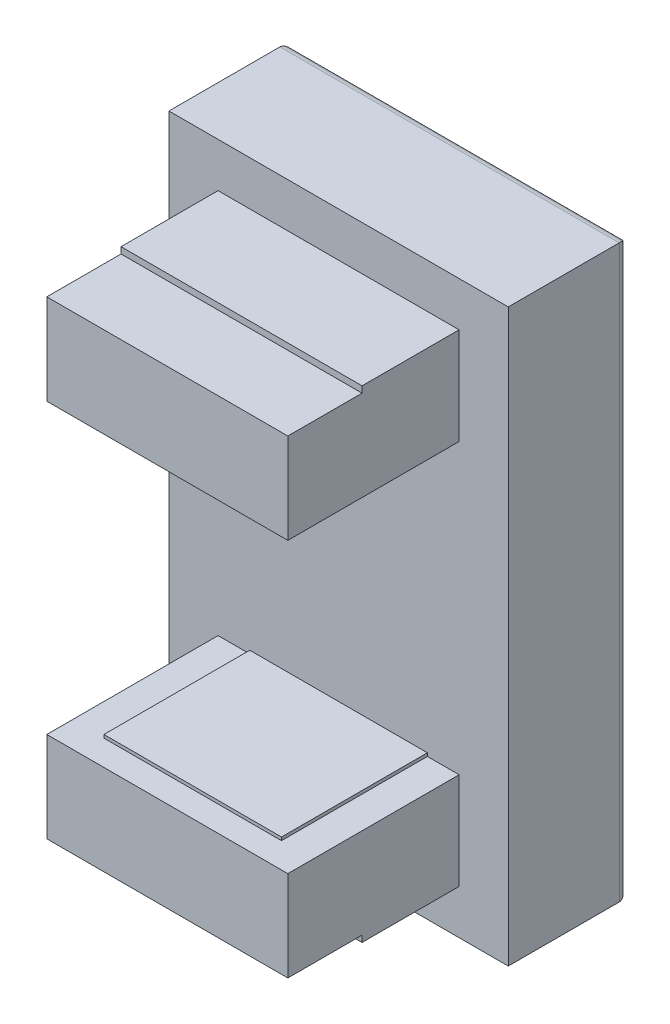
ISO-10303-21;
HEADER;
FILE_DESCRIPTION(('STEP AP214'),'2;1');
FILE_NAME('part.step','',(''),(''),'','','');
FILE_SCHEMA(('AUTOMOTIVE_DESIGN { 1 0 10303 214 1 1 1 1 }'));
ENDSEC;
DATA;
#1=APPLICATION_CONTEXT('core data for automotive mechanical design processes');
#2=APPLICATION_PROTOCOL_DEFINITION('international standard','automotive_design',2000,#1);
#3=PRODUCT_CONTEXT('',#1,'mechanical');
#4=PRODUCT('Part','Part','',(#3));
#5=PRODUCT_RELATED_PRODUCT_CATEGORY('part','',(#4));
#6=PRODUCT_DEFINITION_FORMATION('','',#4);
#7=PRODUCT_DEFINITION_CONTEXT('part definition',#1,'design');
#8=PRODUCT_DEFINITION('design','',#6,#7);
#9=PRODUCT_DEFINITION_SHAPE('','',#8);
#10=(LENGTH_UNIT() NAMED_UNIT(*) SI_UNIT(.MILLI.,.METRE.));
#11=(NAMED_UNIT(*) PLANE_ANGLE_UNIT() SI_UNIT($,.RADIAN.));
#12=(NAMED_UNIT(*) SI_UNIT($,.STERADIAN.) SOLID_ANGLE_UNIT());
#13=UNCERTAINTY_MEASURE_WITH_UNIT(LENGTH_MEASURE(1.E-05),#10,'distance_accuracy_value','');
#14=(GEOMETRIC_REPRESENTATION_CONTEXT(3) GLOBAL_UNCERTAINTY_ASSIGNED_CONTEXT((#13)) GLOBAL_UNIT_ASSIGNED_CONTEXT((#10,
#11,#12)) REPRESENTATION_CONTEXT('',''));
#15=CARTESIAN_POINT('',(0.,0.,0.));
#16=DIRECTION('',(0.,0.,1.));
#17=DIRECTION('',(1.,0.,0.));
#18=AXIS2_PLACEMENT_3D('',#15,#16,#17);
#19=CARTESIAN_POINT('',(59.620001155307,70.760000207209,-1.870522106092));
#20=DIRECTION('',(8.74227765734796E-08,0.999999999999995,4.37113882867398E-08));
#21=DIRECTION('',(-0.999999999999996,8.74227765734797E-08,0.));
#22=AXIS2_PLACEMENT_3D('',#19,#20,#21);
#23=PLANE('',#22);
#24=DIRECTION('',(0.,0.,1.));
#25=VECTOR('',#24,1.);
#26=CARTESIAN_POINT('',(54.6200011553068,70.760000634095,-2.556522040525));
#27=LINE('',#26,#25);
#28=CARTESIAN_POINT('',(54.620001155307,70.7600006008744,-1.63652210297748));
#29=VERTEX_POINT('',#28);
#30=CARTESIAN_POINT('',(54.62000115487,70.7600006417659,-1.87052210609216));
#31=VERTEX_POINT('',#30);
#32=EDGE_CURVE('E352',#29,#31,#27,.F.);
#33=ORIENTED_EDGE('',*,*,#32,.T.);
#34=DIRECTION('',(1.,0.,0.));
#35=VECTOR('',#34,1.);
#36=CARTESIAN_POINT('',(59.620001152684,70.760000644323,-1.87052210609264));
#37=LINE('',#36,#35);
#38=CARTESIAN_POINT('',(55.380001155307,70.7600006111024,-1.87052210631081));
#39=VERTEX_POINT('',#38);
#40=EDGE_CURVE('E379',#31,#39,#37,.T.);
#41=ORIENTED_EDGE('',*,*,#40,.T.);
#42=DIRECTION('',(0.,0.,1.));
#43=VECTOR('',#42,1.);
#44=CARTESIAN_POINT('',(55.3800011553068,70.760000577882,-2.556522040525));
#45=LINE('',#44,#43);
#46=CARTESIAN_POINT('',(55.380001161536,70.7600005702106,-1.63652210609199));
#47=VERTEX_POINT('',#46);
#48=EDGE_CURVE('E366',#39,#47,#45,.T.);
#49=ORIENTED_EDGE('',*,*,#48,.T.);
#50=DIRECTION('',(1.,0.,0.));
#51=VECTOR('',#50,1.);
#52=CARTESIAN_POINT('',(59.620001155307,70.760000567654,-1.63652210609198));
#53=LINE('',#52,#51);
#54=EDGE_CURVE('E377',#47,#29,#53,.F.);
#55=ORIENTED_EDGE('',*,*,#54,.T.);
#56=EDGE_LOOP('',(#33,#41,#49,#55));
#57=FACE_BOUND('',#56,.T.);
#58=ADVANCED_FACE('F17',(#57),#23,.F.);
#59=CARTESIAN_POINT('',(59.620001152684,70.730000207209,-1.870522107404));
#60=DIRECTION('',(0.,4.371138828674E-08,-0.999999999999999));
#61=DIRECTION('',(0.,0.999999999999999,4.371138828674E-08));
#62=AXIS2_PLACEMENT_3D('',#59,#60,#61);
#63=PLANE('',#62);
#64=DIRECTION('',(8.74227765734797E-08,0.999999999999996,0.));
#65=VECTOR('',#64,1.);
#66=CARTESIAN_POINT('',(54.620001286441,72.260000674309,-1.870522106092));
#67=LINE('',#66,#65);
#68=CARTESIAN_POINT('',(54.6200011535588,70.7400006277129,-1.87052210674771));
#69=VERTEX_POINT('',#68);
#70=EDGE_CURVE('E349',#31,#69,#67,.F.);
#71=ORIENTED_EDGE('',*,*,#70,.T.);
#72=DIRECTION('',(-0.999999999999996,8.74227765734797E-08,0.));
#73=VECTOR('',#72,1.);
#74=CARTESIAN_POINT('',(55.380001153559,70.740000577882,-1.870522106966));
#75=LINE('',#74,#73);
#76=CARTESIAN_POINT('',(55.3800011539957,70.74000058457,-1.87052210696621));
#77=VERTEX_POINT('',#76);
#78=EDGE_CURVE('E359',#69,#77,#75,.F.);
#79=ORIENTED_EDGE('',*,*,#78,.T.);
#80=DIRECTION('',(-8.74227765734797E-08,-0.999999999999996,0.));
#81=VECTOR('',#80,1.);
#82=CARTESIAN_POINT('',(55.380001286441,72.260000607868,-1.870522106966));
#83=LINE('',#82,#81);
#84=EDGE_CURVE('E368',#77,#39,#83,.F.);
#85=ORIENTED_EDGE('',*,*,#84,.T.);
#86=ORIENTED_EDGE('',*,*,#40,.F.);
#87=EDGE_LOOP('',(#71,#79,#85,#86));
#88=FACE_BOUND('',#87,.T.);
#89=ADVANCED_FACE('F722',(#88),#63,.F.);
#90=CARTESIAN_POINT('',(59.620001155307,70.760000196981,-1.636522106092));
#91=DIRECTION('',(0.,4.371138828674E-08,-0.999999999999999));
#92=DIRECTION('',(0.,0.999999999999999,4.371138828674E-08));
#93=AXIS2_PLACEMENT_3D('',#90,#91,#92);
#94=PLANE('',#93);
#95=DIRECTION('',(8.74227765734797E-08,0.999999999999996,0.));
#96=VECTOR('',#95,1.);
#97=CARTESIAN_POINT('',(54.620001286441,72.260000674309,-1.636522093634));
#98=LINE('',#97,#96);
#99=CARTESIAN_POINT('',(54.6200011677648,71.0450006399959,-1.63652209363411));
#100=VERTEX_POINT('',#99);
#101=EDGE_CURVE('E354',#100,#29,#98,.F.);
#102=ORIENTED_EDGE('',*,*,#101,.T.);
#103=ORIENTED_EDGE('',*,*,#54,.F.);
#104=DIRECTION('',(-8.74227765734797E-08,-0.999999999999996,0.));
#105=VECTOR('',#104,1.);
#106=CARTESIAN_POINT('',(55.380001286441,72.260000607868,-1.636522106092));
#107=LINE('',#106,#105);
#108=CARTESIAN_POINT('',(55.3800011802228,71.0450006008743,-1.63652209674861));
#109=VERTEX_POINT('',#108);
#110=EDGE_CURVE('E364',#47,#109,#107,.F.);
#111=ORIENTED_EDGE('',*,*,#110,.T.);
#112=DIRECTION('',(0.999999999999996,-8.74227765734797E-08,0.));
#113=VECTOR('',#112,1.);
#114=CARTESIAN_POINT('',(55.380001180223,71.0450005676532,-1.636522093634));
#115=LINE('',#114,#113);
#116=EDGE_CURVE('E347',#109,#100,#115,.F.);
#117=ORIENTED_EDGE('',*,*,#116,.T.);
#118=EDGE_LOOP('',(#102,#103,#111,#117));
#119=FACE_BOUND('',#118,.T.);
#120=ADVANCED_FACE('F712',(#119),#94,.F.);
#121=CARTESIAN_POINT('',(55.380001180223,71.04500057115,-1.716522093634));
#122=DIRECTION('',(0.,4.371138828674E-08,-0.999999999999999));
#123=DIRECTION('',(0.,0.999999999999999,4.371138828674E-08));
#124=AXIS2_PLACEMENT_3D('',#121,#122,#123);
#125=PLANE('',#124);
#126=DIRECTION('',(-8.74227765734797E-08,-0.999999999999996,0.));
#127=VECTOR('',#126,1.);
#128=CARTESIAN_POINT('',(55.280001259777,71.955000575522,-1.716522093634));
#129=LINE('',#128,#127);
#130=CARTESIAN_POINT('',(55.2800011806598,71.0450005849196,-1.716522093634));
#131=VERTEX_POINT('',#130);
#132=CARTESIAN_POINT('',(55.2800011810968,71.0550005921322,-1.71652209341547));
#133=VERTEX_POINT('',#132);
#134=EDGE_CURVE('E371',#131,#133,#129,.F.);
#135=ORIENTED_EDGE('',*,*,#134,.T.);
#136=DIRECTION('',(-0.999999999999996,8.74227765734797E-08,0.));
#137=VECTOR('',#136,1.);
#138=CARTESIAN_POINT('',(59.620001181097,71.0550002004778,-1.716522093197));
#139=LINE('',#138,#137);
#140=CARTESIAN_POINT('',(54.7200011808782,71.0550006389033,-1.71652209319697));
#141=VERTEX_POINT('',#140);
#142=EDGE_CURVE('E324',#141,#133,#139,.F.);
#143=ORIENTED_EDGE('',*,*,#142,.F.);
#144=DIRECTION('',(8.74227765734797E-08,0.999999999999996,0.));
#145=VECTOR('',#144,1.);
#146=CARTESIAN_POINT('',(54.720001259777,71.955000624478,-1.716522093197));
#147=LINE('',#146,#145);
#148=CARTESIAN_POINT('',(54.7200011802228,71.0450006166103,-1.71652209352475));
#149=VERTEX_POINT('',#148);
#150=EDGE_CURVE('E333',#141,#149,#147,.F.);
#151=ORIENTED_EDGE('',*,*,#150,.T.);
#152=DIRECTION('',(0.999999999999996,-8.74227765734797E-08,0.));
#153=VECTOR('',#152,1.);
#154=CARTESIAN_POINT('',(55.380001180223,71.0450005711501,-1.716522093634));
#155=LINE('',#154,#153);
#156=EDGE_CURVE('E343',#149,#131,#155,.T.);
#157=ORIENTED_EDGE('',*,*,#156,.T.);
#158=EDGE_LOOP('',(#135,#143,#151,#157));
#159=FACE_BOUND('',#158,.T.);
#160=ADVANCED_FACE('F702',(#159),#125,.F.);
#161=CARTESIAN_POINT('',(55.380001180223,71.04500057115,-1.716522093634));
#162=DIRECTION('',(0.,4.371138828674E-08,-0.999999999999999));
#163=DIRECTION('',(0.,0.999999999999999,4.371138828674E-08));
#164=AXIS2_PLACEMENT_3D('',#161,#162,#163);
#165=PLANE('',#164);
#166=DIRECTION('',(8.74227765734797E-08,0.999999999999996,0.));
#167=VECTOR('',#166,1.);
#168=CARTESIAN_POINT('',(54.720001259777,71.955000624478,-1.716522053857));
#169=LINE('',#168,#167);
#170=CARTESIAN_POINT('',(54.72000125934,71.9550006338766,-1.71652205385682));
#171=VERTEX_POINT('',#170);
#172=CARTESIAN_POINT('',(54.7200012589029,71.9450006166105,-1.71652205418469));
#173=VERTEX_POINT('',#172);
#174=EDGE_CURVE('E299',#171,#173,#169,.F.);
#175=ORIENTED_EDGE('',*,*,#174,.T.);
#176=DIRECTION('',(0.999999999999996,-8.74227765734797E-08,0.));
#177=VECTOR('',#176,1.);
#178=CARTESIAN_POINT('',(59.620001258903,71.945000200478,-1.716522054294));
#179=LINE('',#178,#177);
#180=CARTESIAN_POINT('',(55.2800012593399,71.9450005849197,-1.71652205429388));
#181=VERTEX_POINT('',#180);
#182=EDGE_CURVE('E307',#181,#173,#179,.F.);
#183=ORIENTED_EDGE('',*,*,#182,.F.);
#184=DIRECTION('',(-8.74227765734797E-08,-0.999999999999996,0.));
#185=VECTOR('',#184,1.);
#186=CARTESIAN_POINT('',(55.280001259777,71.955000575522,-1.716522054294));
#187=LINE('',#186,#185);
#188=CARTESIAN_POINT('',(55.280001259777,71.9550005921321,-1.71652205407541));
#189=VERTEX_POINT('',#188);
#190=EDGE_CURVE('E309',#181,#189,#187,.F.);
#191=ORIENTED_EDGE('',*,*,#190,.T.);
#192=DIRECTION('',(-0.999999999999996,8.74227765734797E-08,0.));
#193=VECTOR('',#192,1.);
#194=CARTESIAN_POINT('',(55.380001259777,71.9550005711502,-1.716522053857));
#195=LINE('',#194,#193);
#196=EDGE_CURVE('E291',#189,#171,#195,.T.);
#197=ORIENTED_EDGE('',*,*,#196,.T.);
#198=EDGE_LOOP('',(#175,#183,#191,#197));
#199=FACE_BOUND('',#198,.T.);
#200=ADVANCED_FACE('F692',(#199),#165,.F.);
#201=CARTESIAN_POINT('',(59.620001287316,72.270000207209,-1.870522040088));
#202=DIRECTION('',(0.,-4.371138828674E-08,0.999999999999999));
#203=DIRECTION('',(0.,-0.999999999999999,-4.371138828674E-08));
#204=AXIS2_PLACEMENT_3D('',#201,#202,#203);
#205=PLANE('',#204);
#206=DIRECTION('',(8.74227765734797E-08,0.999999999999996,0.));
#207=VECTOR('',#206,1.);
#208=CARTESIAN_POINT('',(54.620001286441,72.260000674309,-1.870522040525));
#209=LINE('',#208,#207);
#210=CARTESIAN_POINT('',(54.620001286441,72.2600006310569,-1.87052204052502));
#211=VERTEX_POINT('',#210);
#212=CARTESIAN_POINT('',(54.6200012855669,72.2400006443231,-1.87052204118065));
#213=VERTEX_POINT('',#212);
#214=EDGE_CURVE('E287',#211,#213,#209,.F.);
#215=ORIENTED_EDGE('',*,*,#214,.T.);
#216=DIRECTION('',(0.999999999999996,-8.74227765734797E-08,0.));
#217=VECTOR('',#216,1.);
#218=CARTESIAN_POINT('',(59.620001284693,72.2400002072095,-1.870522041399));
#219=LINE('',#218,#217);
#220=CARTESIAN_POINT('',(55.3800012846929,72.2400005919353,-1.87052204139908));
#221=VERTEX_POINT('',#220);
#222=EDGE_CURVE('E375',#213,#221,#219,.T.);
#223=ORIENTED_EDGE('',*,*,#222,.T.);
#224=DIRECTION('',(-8.74227765734797E-08,-0.999999999999996,0.));
#225=VECTOR('',#224,1.);
#226=CARTESIAN_POINT('',(55.380001286441,72.260000607868,-1.870522041399));
#227=LINE('',#226,#225);
#228=CARTESIAN_POINT('',(55.380001286004,72.260000577882,-1.87052204074352));
#229=VERTEX_POINT('',#228);
#230=EDGE_CURVE('E311',#221,#229,#227,.F.);
#231=ORIENTED_EDGE('',*,*,#230,.T.);
#232=DIRECTION('',(0.999999999999996,-8.74227765734797E-08,0.));
#233=VECTOR('',#232,1.);
#234=CARTESIAN_POINT('',(55.380001286441,72.260000577882,-1.870522040525));
#235=LINE('',#234,#233);
#236=EDGE_CURVE('E322',#229,#211,#235,.F.);
#237=ORIENTED_EDGE('',*,*,#236,.T.);
#238=EDGE_LOOP('',(#215,#223,#231,#237));
#239=FACE_BOUND('',#238,.T.);
#240=ADVANCED_FACE('F682',(#239),#205,.T.);
#241=CARTESIAN_POINT('',(59.620001284693,72.240000196981,-1.636522041399));
#242=DIRECTION('',(-8.74227765734796E-08,-0.999999999999995,-4.37113882867398E-08));
#243=DIRECTION('',(0.999999999999996,-8.74227765734797E-08,0.));
#244=AXIS2_PLACEMENT_3D('',#241,#242,#243);
#245=PLANE('',#244);
#246=DIRECTION('',(0.,0.,1.));
#247=VECTOR('',#246,1.);
#248=CARTESIAN_POINT('',(54.6200012846925,72.240000644323,-2.556522040525));
#249=LINE('',#248,#247);
#250=CARTESIAN_POINT('',(54.6200012784639,72.240000636652,-1.63652204139903));
#251=VERTEX_POINT('',#250);
#252=EDGE_CURVE('E285',#213,#251,#249,.T.);
#253=ORIENTED_EDGE('',*,*,#252,.T.);
#254=DIRECTION('',(1.,0.,0.));
#255=VECTOR('',#254,1.);
#256=CARTESIAN_POINT('',(59.620001155307,72.240000634095,-1.63652204139913));
#257=LINE('',#256,#255);
#258=CARTESIAN_POINT('',(55.3800012846929,72.2400006008744,-1.63652204451356));
#259=VERTEX_POINT('',#258);
#260=EDGE_CURVE('E373',#251,#259,#257,.T.);
#261=ORIENTED_EDGE('',*,*,#260,.T.);
#262=DIRECTION('',(0.,0.,1.));
#263=VECTOR('',#262,1.);
#264=CARTESIAN_POINT('',(55.3800012846925,72.240000567654,-2.556522040525));
#265=LINE('',#264,#263);
#266=EDGE_CURVE('E314',#259,#221,#265,.F.);
#267=ORIENTED_EDGE('',*,*,#266,.T.);
#268=ORIENTED_EDGE('',*,*,#222,.F.);
#269=EDGE_LOOP('',(#253,#261,#267,#268));
#270=FACE_BOUND('',#269,.T.);
#271=ADVANCED_FACE('F672',(#270),#245,.F.);
#272=CARTESIAN_POINT('',(59.620001155307,70.760000196981,-1.636522106092));
#273=DIRECTION('',(0.,4.371138828674E-08,-0.999999999999999));
#274=DIRECTION('',(0.,0.999999999999999,4.371138828674E-08));
#275=AXIS2_PLACEMENT_3D('',#272,#273,#274);
#276=PLANE('',#275);
#277=DIRECTION('',(-0.999999999999996,8.74227765734797E-08,0.));
#278=VECTOR('',#277,1.);
#279=CARTESIAN_POINT('',(55.380001259777,71.9550005676532,-1.636522053857));
#280=LINE('',#279,#278);
#281=CARTESIAN_POINT('',(54.620001259777,71.9550006174845,-1.63652205074246));
#282=VERTEX_POINT('',#281);
#283=CARTESIAN_POINT('',(55.380001272235,71.9550005735548,-1.63652205385693));
#284=VERTEX_POINT('',#283);
#285=EDGE_CURVE('E209',#282,#284,#280,.F.);
#286=ORIENTED_EDGE('',*,*,#285,.T.);
#287=DIRECTION('',(-8.74227765734797E-08,-0.999999999999996,0.));
#288=VECTOR('',#287,1.);
#289=CARTESIAN_POINT('',(55.380001286441,72.260000607868,-1.636522053857));
#290=LINE('',#289,#288);
#291=EDGE_CURVE('E317',#284,#259,#290,.F.);
#292=ORIENTED_EDGE('',*,*,#291,.T.);
#293=ORIENTED_EDGE('',*,*,#260,.F.);
#294=DIRECTION('',(8.74227765734797E-08,0.999999999999996,0.));
#295=VECTOR('',#294,1.);
#296=CARTESIAN_POINT('',(54.620001286441,72.260000674309,-1.636522041399));
#297=LINE('',#296,#295);
#298=EDGE_CURVE('E275',#251,#282,#297,.F.);
#299=ORIENTED_EDGE('',*,*,#298,.T.);
#300=EDGE_LOOP('',(#286,#292,#293,#299));
#301=FACE_BOUND('',#300,.T.);
#302=ADVANCED_FACE('F662',(#301),#276,.F.);
#303=CARTESIAN_POINT('',(55.280001259777,71.955000575522,-1.616522053857));
#304=DIRECTION('',(-0.999999999999996,8.74227765734797E-08,0.));
#305=DIRECTION('',(-8.74227765734797E-08,-0.999999999999996,0.));
#306=AXIS2_PLACEMENT_3D('',#303,#304,#305);
#307=PLANE('',#306);
#308=DIRECTION('',(0.,-4.37113882867396E-08,0.999999999999999));
#309=VECTOR('',#308,1.);
#310=CARTESIAN_POINT('',(55.280001180223,71.0450005755213,-1.616522093634));
#311=LINE('',#310,#309);
#312=CARTESIAN_POINT('',(55.2800011804411,71.0450005999999,-2.17652209341567));
#313=VERTEX_POINT('',#312);
#314=EDGE_CURVE('E341',#131,#313,#311,.F.);
#315=ORIENTED_EDGE('',*,*,#314,.T.);
#316=DIRECTION('',(0.,-0.999999999999999,-4.371138828674E-08));
#317=VECTOR('',#316,1.);
#318=CARTESIAN_POINT('',(55.280001181097,71.500000624478,-2.176522073746));
#319=LINE('',#318,#317);
#320=CARTESIAN_POINT('',(55.2800011810967,71.0550006021857,-2.17652209319714));
#321=VERTEX_POINT('',#320);
#322=EDGE_CURVE('E270',#321,#313,#319,.T.);
#323=ORIENTED_EDGE('',*,*,#322,.F.);
#324=DIRECTION('',(0.,-4.37113882867396E-08,0.999999999999999));
#325=VECTOR('',#324,1.);
#326=CARTESIAN_POINT('',(55.280001181097,71.0550005999998,-2.176522093197));
#327=LINE('',#326,#325);
#328=EDGE_CURVE('E330',#133,#321,#327,.F.);
#329=ORIENTED_EDGE('',*,*,#328,.F.);
#330=ORIENTED_EDGE('',*,*,#134,.F.);
#331=EDGE_LOOP('',(#315,#323,#329,#330));
#332=FACE_BOUND('',#331,.T.);
#333=ADVANCED_FACE('F652',(#332),#307,.F.);
#334=CARTESIAN_POINT('',(55.380001286441,72.260000607868,-2.556522040525));
#335=DIRECTION('',(-0.999999999999996,8.74227765734797E-08,0.));
#336=DIRECTION('',(-8.74227765734797E-08,-0.999999999999996,0.));
#337=AXIS2_PLACEMENT_3D('',#334,#335,#336);
#338=PLANE('',#337);
#339=ORIENTED_EDGE('',*,*,#48,.F.);
#340=ORIENTED_EDGE('',*,*,#84,.F.);
#341=DIRECTION('',(0.,-4.37113882867396E-08,0.999999999999999));
#342=VECTOR('',#341,1.);
#343=CARTESIAN_POINT('',(55.380001153559,70.740000607868,-2.556522106966));
#344=LINE('',#343,#342);
#345=CARTESIAN_POINT('',(55.3800011602247,70.7400005912579,-2.17652210030016));
#346=VERTEX_POINT('',#345);
#347=EDGE_CURVE('E362',#77,#346,#344,.F.);
#348=ORIENTED_EDGE('',*,*,#347,.T.);
#349=DIRECTION('',(0.,-0.999999999999999,-4.371138828674E-08));
#350=VECTOR('',#349,1.);
#351=CARTESIAN_POINT('',(55.380001180223,71.500000624478,-2.176522073746));
#352=LINE('',#351,#350);
#353=CARTESIAN_POINT('',(55.3800011802228,71.0450005875422,-2.17652209363417));
#354=VERTEX_POINT('',#353);
#355=EDGE_CURVE('E264',#354,#346,#352,.T.);
#356=ORIENTED_EDGE('',*,*,#355,.F.);
#357=DIRECTION('',(0.,-4.37113882867396E-08,0.999999999999999));
#358=VECTOR('',#357,1.);
#359=CARTESIAN_POINT('',(55.380001180223,71.045000566779,-1.616522093634));
#360=LINE('',#359,#358);
#361=EDGE_CURVE('E338',#354,#109,#360,.T.);
#362=ORIENTED_EDGE('',*,*,#361,.T.);
#363=ORIENTED_EDGE('',*,*,#110,.F.);
#364=EDGE_LOOP('',(#339,#340,#348,#356,#362,#363));
#365=FACE_BOUND('',#364,.T.);
#366=ADVANCED_FACE('F642',(#365),#338,.F.);
#367=CARTESIAN_POINT('',(55.380001153559,70.740000607868,-2.556522106966));
#368=DIRECTION('',(8.74227765734796E-08,0.999999999999995,4.37113882867398E-08));
#369=DIRECTION('',(-0.999999999999996,8.74227765734797E-08,0.));
#370=AXIS2_PLACEMENT_3D('',#367,#368,#369);
#371=PLANE('',#370);
#372=DIRECTION('',(0.,0.,1.));
#373=VECTOR('',#372,1.);
#374=CARTESIAN_POINT('',(54.6200011535584,70.740000644323,-2.556522040525));
#375=LINE('',#374,#373);
#376=CARTESIAN_POINT('',(54.6200011535588,70.7400006377447,-2.17652210696616));
#377=VERTEX_POINT('',#376);
#378=EDGE_CURVE('E357',#69,#377,#375,.F.);
#379=ORIENTED_EDGE('',*,*,#378,.T.);
#380=DIRECTION('',(1.,0.,0.));
#381=VECTOR('',#380,1.);
#382=CARTESIAN_POINT('',(55.00000122,70.740000591258,-2.17652210696666));
#383=LINE('',#382,#381);
#384=EDGE_CURVE('E261',#346,#377,#383,.F.);
#385=ORIENTED_EDGE('',*,*,#384,.F.);
#386=ORIENTED_EDGE('',*,*,#347,.F.);
#387=ORIENTED_EDGE('',*,*,#78,.F.);
#388=EDGE_LOOP('',(#379,#385,#386,#387));
#389=FACE_BOUND('',#388,.T.);
#390=ADVANCED_FACE('F632',(#389),#371,.F.);
#391=CARTESIAN_POINT('',(54.620001286441,72.260000674309,-2.556522040525));
#392=DIRECTION('',(0.999999999999996,-8.74227765734797E-08,0.));
#393=DIRECTION('',(8.74227765734797E-08,0.999999999999996,0.));
#394=AXIS2_PLACEMENT_3D('',#391,#392,#393);
#395=PLANE('',#394);
#396=ORIENTED_EDGE('',*,*,#32,.F.);
#397=ORIENTED_EDGE('',*,*,#101,.F.);
#398=DIRECTION('',(0.,-4.37113882867396E-08,0.999999999999999));
#399=VECTOR('',#398,1.);
#400=CARTESIAN_POINT('',(54.620001180223,71.0450006332203,-1.616522093634));
#401=LINE('',#400,#399);
#402=CARTESIAN_POINT('',(54.6200011735567,71.0450006576989,-2.17652210030017));
#403=VERTEX_POINT('',#402);
#404=EDGE_CURVE('E345',#100,#403,#401,.F.);
#405=ORIENTED_EDGE('',*,*,#404,.T.);
#406=DIRECTION('',(0.,-0.999999999999999,-4.371138828674E-08));
#407=VECTOR('',#406,1.);
#408=CARTESIAN_POINT('',(54.620001153559,71.500000624478,-2.176522073746));
#409=LINE('',#408,#407);
#410=EDGE_CURVE('E258',#377,#403,#409,.F.);
#411=ORIENTED_EDGE('',*,*,#410,.F.);
#412=ORIENTED_EDGE('',*,*,#378,.F.);
#413=ORIENTED_EDGE('',*,*,#70,.F.);
#414=EDGE_LOOP('',(#396,#397,#405,#411,#412,#413));
#415=FACE_BOUND('',#414,.T.);
#416=ADVANCED_FACE('F622',(#415),#395,.F.);
#417=CARTESIAN_POINT('',(55.380001180223,71.045000566779,-1.616522093634));
#418=DIRECTION('',(-8.74227765734796E-08,-0.999999999999995,-4.37113882867398E-08));
#419=DIRECTION('',(0.999999999999996,-8.74227765734797E-08,0.));
#420=AXIS2_PLACEMENT_3D('',#417,#418,#419);
#421=PLANE('',#420);
#422=DIRECTION('',(1.,0.,0.));
#423=VECTOR('',#422,1.);
#424=CARTESIAN_POINT('',(55.00000122,71.0450006,-2.17652209363468));
#425=LINE('',#424,#423);
#426=EDGE_CURVE('E267',#313,#354,#425,.T.);
#427=ORIENTED_EDGE('',*,*,#426,.F.);
#428=ORIENTED_EDGE('',*,*,#314,.F.);
#429=ORIENTED_EDGE('',*,*,#156,.F.);
#430=DIRECTION('',(0.,0.,1.));
#431=VECTOR('',#430,1.);
#432=CARTESIAN_POINT('',(54.7200011802223,71.04500062885,-1.616522053857));
#433=LINE('',#432,#431);
#434=CARTESIAN_POINT('',(54.7200011802228,71.0450006461155,-2.17652209363417));
#435=VERTEX_POINT('',#434);
#436=EDGE_CURVE('E336',#149,#435,#433,.F.);
#437=ORIENTED_EDGE('',*,*,#436,.T.);
#438=DIRECTION('',(1.,0.,0.));
#439=VECTOR('',#438,1.);
#440=CARTESIAN_POINT('',(55.00000122,71.045000657699,-2.17652209363468));
#441=LINE('',#440,#439);
#442=EDGE_CURVE('E255',#403,#435,#441,.T.);
#443=ORIENTED_EDGE('',*,*,#442,.F.);
#444=ORIENTED_EDGE('',*,*,#404,.F.);
#445=ORIENTED_EDGE('',*,*,#116,.F.);
#446=ORIENTED_EDGE('',*,*,#361,.F.);
#447=EDGE_LOOP('',(#427,#428,#429,#437,#443,#444,#445,#446));
#448=FACE_BOUND('',#447,.T.);
#449=ADVANCED_FACE('F612',(#448),#421,.F.);
#450=CARTESIAN_POINT('',(54.720001259777,71.955000624478,-1.616522053857));
#451=DIRECTION('',(0.999999999999996,-8.74227765734797E-08,0.));
#452=DIRECTION('',(8.74227765734797E-08,0.999999999999996,0.));
#453=AXIS2_PLACEMENT_3D('',#450,#451,#452);
#454=PLANE('',#453);
#455=DIRECTION('',(0.,-4.37113882867396E-08,0.999999999999999));
#456=VECTOR('',#455,1.);
#457=CARTESIAN_POINT('',(54.720001181097,71.0550006489566,-2.176522093197));
#458=LINE('',#457,#456);
#459=CARTESIAN_POINT('',(54.7200011808782,71.0550006489569,-2.17652209341564));
#460=VERTEX_POINT('',#459);
#461=EDGE_CURVE('E327',#460,#141,#458,.T.);
#462=ORIENTED_EDGE('',*,*,#461,.F.);
#463=DIRECTION('',(0.,-0.999999999999999,-4.371138828674E-08));
#464=VECTOR('',#463,1.);
#465=CARTESIAN_POINT('',(54.720001180223,71.500000624478,-2.176522073746));
#466=LINE('',#465,#464);
#467=EDGE_CURVE('E252',#435,#460,#466,.F.);
#468=ORIENTED_EDGE('',*,*,#467,.F.);
#469=ORIENTED_EDGE('',*,*,#436,.F.);
#470=ORIENTED_EDGE('',*,*,#150,.F.);
#471=EDGE_LOOP('',(#462,#468,#469,#470));
#472=FACE_BOUND('',#471,.T.);
#473=ADVANCED_FACE('F602',(#472),#454,.F.);
#474=CARTESIAN_POINT('',(59.620001181097,71.055000220585,-2.176522093197));
#475=DIRECTION('',(8.74227765734796E-08,0.999999999999995,4.37113882867398E-08));
#476=DIRECTION('',(-0.999999999999996,8.74227765734797E-08,0.));
#477=AXIS2_PLACEMENT_3D('',#474,#475,#476);
#478=PLANE('',#477);
#479=ORIENTED_EDGE('',*,*,#461,.T.);
#480=ORIENTED_EDGE('',*,*,#142,.T.);
#481=ORIENTED_EDGE('',*,*,#328,.T.);
#482=DIRECTION('',(1.,0.,0.));
#483=VECTOR('',#482,1.);
#484=CARTESIAN_POINT('',(55.00000122,71.055000648957,-2.17652209319757));
#485=LINE('',#484,#483);
#486=EDGE_CURVE('E249',#460,#321,#485,.T.);
#487=ORIENTED_EDGE('',*,*,#486,.F.);
#488=EDGE_LOOP('',(#479,#480,#481,#487));
#489=FACE_BOUND('',#488,.T.);
#490=ADVANCED_FACE('F592',(#489),#478,.T.);
#491=CARTESIAN_POINT('',(55.380001286441,72.260000607868,-2.556522040525));
#492=DIRECTION('',(-8.74227765734796E-08,-0.999999999999995,-4.37113882867398E-08));
#493=DIRECTION('',(0.999999999999996,-8.74227765734797E-08,0.));
#494=AXIS2_PLACEMENT_3D('',#491,#492,#493);
#495=PLANE('',#494);
#496=DIRECTION('',(0.,0.,1.));
#497=VECTOR('',#496,1.);
#498=CARTESIAN_POINT('',(55.380001286441,72.260000577882,-2.556522040525));
#499=LINE('',#498,#497);
#500=CARTESIAN_POINT('',(55.380001286441,72.2600006045241,-2.17652204052509));
#501=VERTEX_POINT('',#500);
#502=EDGE_CURVE('E320',#229,#501,#499,.F.);
#503=ORIENTED_EDGE('',*,*,#502,.T.);
#504=DIRECTION('',(1.,0.,0.));
#505=VECTOR('',#504,1.);
#506=CARTESIAN_POINT('',(55.00000122,72.260000657699,-2.17652204052534));
#507=LINE('',#506,#505);
#508=CARTESIAN_POINT('',(54.620001279775,72.260000657699,-2.17652204385809));
#509=VERTEX_POINT('',#508);
#510=EDGE_CURVE('E247',#509,#501,#507,.T.);
#511=ORIENTED_EDGE('',*,*,#510,.F.);
#512=DIRECTION('',(0.,0.,1.));
#513=VECTOR('',#512,1.);
#514=CARTESIAN_POINT('',(54.620001286441,72.260000657699,-2.556522040525));
#515=LINE('',#514,#513);
#516=EDGE_CURVE('E213',#509,#211,#515,.T.);
#517=ORIENTED_EDGE('',*,*,#516,.T.);
#518=ORIENTED_EDGE('',*,*,#236,.F.);
#519=EDGE_LOOP('',(#503,#511,#517,#518));
#520=FACE_BOUND('',#519,.T.);
#521=ADVANCED_FACE('F582',(#520),#495,.F.);
#522=CARTESIAN_POINT('',(55.380001286441,72.260000607868,-2.556522040525));
#523=DIRECTION('',(-0.999999999999996,8.74227765734797E-08,0.));
#524=DIRECTION('',(-8.74227765734797E-08,-0.999999999999996,0.));
#525=AXIS2_PLACEMENT_3D('',#522,#523,#524);
#526=PLANE('',#525);
#527=ORIENTED_EDGE('',*,*,#266,.F.);
#528=ORIENTED_EDGE('',*,*,#291,.F.);
#529=DIRECTION('',(0.,-4.37113882867396E-08,0.999999999999999));
#530=VECTOR('',#529,1.);
#531=CARTESIAN_POINT('',(55.380001259777,71.955000566779,-1.616522053857));
#532=LINE('',#531,#530);
#533=CARTESIAN_POINT('',(55.380001266443,71.9550005912579,-2.17652204719108));
#534=VERTEX_POINT('',#533);
#535=EDGE_CURVE('E296',#284,#534,#532,.F.);
#536=ORIENTED_EDGE('',*,*,#535,.T.);
#537=DIRECTION('',(0.,-0.999999999999999,-4.371138828674E-08));
#538=VECTOR('',#537,1.);
#539=CARTESIAN_POINT('',(55.380001286441,71.500000624478,-2.176522073746));
#540=LINE('',#539,#538);
#541=EDGE_CURVE('E244',#501,#534,#540,.T.);
#542=ORIENTED_EDGE('',*,*,#541,.F.);
#543=ORIENTED_EDGE('',*,*,#502,.F.);
#544=ORIENTED_EDGE('',*,*,#230,.F.);
#545=EDGE_LOOP('',(#527,#528,#536,#542,#543,#544));
#546=FACE_BOUND('',#545,.T.);
#547=ADVANCED_FACE('F572',(#546),#526,.F.);
#548=CARTESIAN_POINT('',(55.280001259777,71.955000575522,-1.616522053857));
#549=DIRECTION('',(-0.999999999999996,8.74227765734797E-08,0.));
#550=DIRECTION('',(-8.74227765734797E-08,-0.999999999999996,0.));
#551=AXIS2_PLACEMENT_3D('',#548,#549,#550);
#552=PLANE('',#551);
#553=DIRECTION('',(0.,-4.37113882867396E-08,0.999999999999999));
#554=VECTOR('',#553,1.);
#555=CARTESIAN_POINT('',(55.280001258903,71.9450005798928,-1.716522054294));
#556=LINE('',#555,#554);
#557=CARTESIAN_POINT('',(55.2800012591214,71.9450006,-2.17652205407561));
#558=VERTEX_POINT('',#557);
#559=EDGE_CURVE('E304',#558,#181,#556,.T.);
#560=ORIENTED_EDGE('',*,*,#559,.F.);
#561=DIRECTION('',(0.,-0.999999999999999,-4.371138828674E-08));
#562=VECTOR('',#561,1.);
#563=CARTESIAN_POINT('',(55.280001259777,71.500000624478,-2.176522073746));
#564=LINE('',#563,#562);
#565=CARTESIAN_POINT('',(55.280001259777,71.9550005927876,-2.17652205385708));
#566=VERTEX_POINT('',#565);
#567=EDGE_CURVE('E238',#566,#558,#564,.T.);
#568=ORIENTED_EDGE('',*,*,#567,.F.);
#569=DIRECTION('',(0.,-4.37113882867396E-08,0.999999999999999));
#570=VECTOR('',#569,1.);
#571=CARTESIAN_POINT('',(55.280001259777,71.9550005755213,-1.616522053857));
#572=LINE('',#571,#570);
#573=EDGE_CURVE('E293',#566,#189,#572,.T.);
#574=ORIENTED_EDGE('',*,*,#573,.T.);
#575=ORIENTED_EDGE('',*,*,#190,.F.);
#576=EDGE_LOOP('',(#560,#568,#574,#575));
#577=FACE_BOUND('',#576,.T.);
#578=ADVANCED_FACE('F562',(#577),#552,.F.);
#579=CARTESIAN_POINT('',(59.620001258903,71.945000200478,-1.716522054294));
#580=DIRECTION('',(-8.74227765734796E-08,-0.999999999999995,-4.37113882867398E-08));
#581=DIRECTION('',(0.999999999999996,-8.74227765734797E-08,0.));
#582=AXIS2_PLACEMENT_3D('',#579,#580,#581);
#583=PLANE('',#582);
#584=DIRECTION('',(1.,0.,0.));
#585=VECTOR('',#584,1.);
#586=CARTESIAN_POINT('',(55.00000122,71.9450006,-2.17652205429443));
#587=LINE('',#586,#585);
#588=CARTESIAN_POINT('',(54.7200012589029,71.9450006316909,-2.17652205429411));
#589=VERTEX_POINT('',#588);
#590=EDGE_CURVE('E233',#558,#589,#587,.F.);
#591=ORIENTED_EDGE('',*,*,#590,.F.);
#592=ORIENTED_EDGE('',*,*,#559,.T.);
#593=ORIENTED_EDGE('',*,*,#182,.T.);
#594=DIRECTION('',(0.,0.,1.));
#595=VECTOR('',#594,1.);
#596=CARTESIAN_POINT('',(54.7200012589028,71.94500062885,-1.616522053857));
#597=LINE('',#596,#595);
#598=EDGE_CURVE('E302',#173,#589,#597,.F.);
#599=ORIENTED_EDGE('',*,*,#598,.T.);
#600=EDGE_LOOP('',(#591,#592,#593,#599));
#601=FACE_BOUND('',#600,.T.);
#602=ADVANCED_FACE('F552',(#601),#583,.T.);
#603=CARTESIAN_POINT('',(54.720001259777,71.955000624478,-1.616522053857));
#604=DIRECTION('',(0.999999999999996,-8.74227765734797E-08,0.));
#605=DIRECTION('',(8.74227765734797E-08,0.999999999999996,0.));
#606=AXIS2_PLACEMENT_3D('',#603,#604,#605);
#607=PLANE('',#606);
#608=DIRECTION('',(0.,-4.37113882867396E-08,0.999999999999999));
#609=VECTOR('',#608,1.);
#610=CARTESIAN_POINT('',(54.720001259777,71.955000624478,-1.616522053857));
#611=LINE('',#610,#609);
#612=CARTESIAN_POINT('',(54.7200012595585,71.9550006489569,-2.17652205407558));
#613=VERTEX_POINT('',#612);
#614=EDGE_CURVE('E214',#171,#613,#611,.F.);
#615=ORIENTED_EDGE('',*,*,#614,.T.);
#616=DIRECTION('',(0.,-0.999999999999999,-4.371138828674E-08));
#617=VECTOR('',#616,1.);
#618=CARTESIAN_POINT('',(54.720001258903,71.500000624478,-2.176522073746));
#619=LINE('',#618,#617);
#620=EDGE_CURVE('E231',#589,#613,#619,.F.);
#621=ORIENTED_EDGE('',*,*,#620,.F.);
#622=ORIENTED_EDGE('',*,*,#598,.F.);
#623=ORIENTED_EDGE('',*,*,#174,.F.);
#624=EDGE_LOOP('',(#615,#621,#622,#623));
#625=FACE_BOUND('',#624,.T.);
#626=ADVANCED_FACE('F543',(#625),#607,.F.);
#627=CARTESIAN_POINT('',(55.380001259777,71.955000566779,-1.616522053857));
#628=DIRECTION('',(8.74227765734796E-08,0.999999999999995,4.37113882867398E-08));
#629=DIRECTION('',(-0.999999999999996,8.74227765734797E-08,0.));
#630=AXIS2_PLACEMENT_3D('',#627,#628,#629);
#631=PLANE('',#630);
#632=DIRECTION('',(1.,0.,0.));
#633=VECTOR('',#632,1.);
#634=CARTESIAN_POINT('',(55.00000122,71.955000648957,-2.17652205385732));
#635=LINE('',#634,#633);
#636=CARTESIAN_POINT('',(54.620001259777,71.9550006496124,-2.17652205385708));
#637=VERTEX_POINT('',#636);
#638=EDGE_CURVE('E206',#613,#637,#635,.F.);
#639=ORIENTED_EDGE('',*,*,#638,.F.);
#640=ORIENTED_EDGE('',*,*,#614,.F.);
#641=ORIENTED_EDGE('',*,*,#196,.F.);
#642=ORIENTED_EDGE('',*,*,#573,.F.);
#643=DIRECTION('',(1.,0.,0.));
#644=VECTOR('',#643,1.);
#645=CARTESIAN_POINT('',(55.00000122,71.955000591258,-2.17652205385732));
#646=LINE('',#645,#644);
#647=EDGE_CURVE('E241',#534,#566,#646,.F.);
#648=ORIENTED_EDGE('',*,*,#647,.F.);
#649=ORIENTED_EDGE('',*,*,#535,.F.);
#650=ORIENTED_EDGE('',*,*,#285,.F.);
#651=DIRECTION('',(0.,0.,1.));
#652=VECTOR('',#651,1.);
#653=CARTESIAN_POINT('',(54.6200012597771,71.955000634095,-2.556522040525));
#654=LINE('',#653,#652);
#655=EDGE_CURVE('E201',#282,#637,#654,.F.);
#656=ORIENTED_EDGE('',*,*,#655,.T.);
#657=EDGE_LOOP('',(#639,#640,#641,#642,#648,#649,#650,#656));
#658=FACE_BOUND('',#657,.T.);
#659=ADVANCED_FACE('F203',(#658),#631,.F.);
#660=CARTESIAN_POINT('',(54.620001286441,72.260000674309,-2.556522040525));
#661=DIRECTION('',(0.999999999999996,-8.74227765734797E-08,0.));
#662=DIRECTION('',(8.74227765734797E-08,0.999999999999996,0.));
#663=AXIS2_PLACEMENT_3D('',#660,#661,#662);
#664=PLANE('',#663);
#665=ORIENTED_EDGE('',*,*,#252,.F.);
#666=ORIENTED_EDGE('',*,*,#214,.F.);
#667=ORIENTED_EDGE('',*,*,#516,.F.);
#668=DIRECTION('',(0.,-0.999999999999999,-4.371138828674E-08));
#669=VECTOR('',#668,1.);
#670=CARTESIAN_POINT('',(54.620001259777,71.500000624478,-2.176522073746));
#671=LINE('',#670,#669);
#672=EDGE_CURVE('E218',#637,#509,#671,.F.);
#673=ORIENTED_EDGE('',*,*,#672,.F.);
#674=ORIENTED_EDGE('',*,*,#655,.F.);
#675=ORIENTED_EDGE('',*,*,#298,.F.);
#676=EDGE_LOOP('',(#665,#666,#667,#673,#674,#675));
#677=FACE_BOUND('',#676,.T.);
#678=ADVANCED_FACE('F220',(#677),#664,.F.);
#679=CARTESIAN_POINT('',(55.00000122,71.500000624478,-2.176522073746));
#680=DIRECTION('',(0.,-4.371138828674E-08,0.999999999999999));
#681=DIRECTION('',(0.,-0.999999999999999,-4.371138828674E-08));
#682=AXIS2_PLACEMENT_3D('',#679,#680,#681);
#683=PLANE('',#682);
#684=ORIENTED_EDGE('',*,*,#638,.T.);
#685=ORIENTED_EDGE('',*,*,#672,.T.);
#686=ORIENTED_EDGE('',*,*,#510,.T.);
#687=ORIENTED_EDGE('',*,*,#541,.T.);
#688=ORIENTED_EDGE('',*,*,#647,.T.);
#689=ORIENTED_EDGE('',*,*,#567,.T.);
#690=ORIENTED_EDGE('',*,*,#590,.T.);
#691=ORIENTED_EDGE('',*,*,#620,.T.);
#692=EDGE_LOOP('',(#684,#685,#686,#687,#688,#689,#690,#691));
#693=FACE_BOUND('',#692,.T.);
#694=ORIENTED_EDGE('',*,*,#467,.T.);
#695=ORIENTED_EDGE('',*,*,#486,.T.);
#696=ORIENTED_EDGE('',*,*,#322,.T.);
#697=ORIENTED_EDGE('',*,*,#426,.T.);
#698=ORIENTED_EDGE('',*,*,#355,.T.);
#699=ORIENTED_EDGE('',*,*,#384,.T.);
#700=ORIENTED_EDGE('',*,*,#410,.T.);
#701=ORIENTED_EDGE('',*,*,#442,.T.);
#702=EDGE_LOOP('',(#694,#695,#696,#697,#698,#699,#700,#701));
#703=FACE_BOUND('',#702,.T.);
#704=DIRECTION('',(1.,0.,0.));
#705=VECTOR('',#704,1.);
#706=CARTESIAN_POINT('',(55.00000122,70.60000067125,-2.17652211308625));
#707=LINE('',#706,#705);
#708=CARTESIAN_POINT('',(54.465001193773,70.60000067125,-2.17652211308608));
#709=VERTEX_POINT('',#708);
#710=CARTESIAN_POINT('',(55.535001141319,70.6000006088884,-2.17652208685908));
#711=VERTEX_POINT('',#710);
#712=EDGE_CURVE('E273',#709,#711,#707,.T.);
#713=ORIENTED_EDGE('',*,*,#712,.T.);
#714=DIRECTION('',(8.74227765734797E-08,0.999999999999996,0.));
#715=VECTOR('',#714,1.);
#716=CARTESIAN_POINT('',(55.53500129868,72.400000577707,-2.176522034405));
#717=LINE('',#716,#715);
#718=CARTESIAN_POINT('',(55.53500129868,72.4000005879065,-2.176522034405));
#719=VERTEX_POINT('',#718);
#720=EDGE_CURVE('E402',#719,#711,#717,.F.);
#721=ORIENTED_EDGE('',*,*,#720,.F.);
#722=DIRECTION('',(-0.999999999999996,8.74227765734797E-08,0.));
#723=VECTOR('',#722,1.);
#724=CARTESIAN_POINT('',(54.46500129868,72.40000067125,-2.176522034405));
#725=LINE('',#724,#723);
#726=CARTESIAN_POINT('',(54.46500129868,72.40000067125,-2.176522060632));
#727=VERTEX_POINT('',#726);
#728=EDGE_CURVE('E278',#727,#719,#725,.F.);
#729=ORIENTED_EDGE('',*,*,#728,.F.);
#730=DIRECTION('',(-8.74227765734797E-08,-0.999999999999996,0.));
#731=VECTOR('',#730,1.);
#732=CARTESIAN_POINT('',(54.46500129868,72.40000067125,-2.176522113086));
#733=LINE('',#732,#731);
#734=EDGE_CURVE('E225',#709,#727,#733,.F.);
#735=ORIENTED_EDGE('',*,*,#734,.F.);
#736=EDGE_LOOP('',(#713,#721,#729,#735));
#737=FACE_BOUND('',#736,.T.);
#738=ADVANCED_FACE('F227',(#693,#703,#737),#683,.T.);
#739=CARTESIAN_POINT('',(54.46500129868,72.40000067125,-2.176522034405));
#740=DIRECTION('',(-0.999999999999996,8.74227765734797E-08,0.));
#741=DIRECTION('',(-8.74227765734797E-08,-0.999999999999996,0.));
#742=AXIS2_PLACEMENT_3D('',#739,#740,#741);
#743=PLANE('',#742);
#744=DIRECTION('',(0.,-4.37113882867396E-08,0.999999999999999));
#745=VECTOR('',#744,1.);
#746=CARTESIAN_POINT('',(54.46500129868,72.40000067125,-2.176522034405));
#747=LINE('',#746,#745);
#748=CARTESIAN_POINT('',(54.46500129868,72.400000686549,-2.52652203506125));
#749=VERTEX_POINT('',#748);
#750=EDGE_CURVE('E281',#749,#727,#747,.T.);
#751=ORIENTED_EDGE('',*,*,#750,.F.);
#752=DIRECTION('',(8.74227765734796E-08,0.999999999999995,4.37113882867398E-08));
#753=VECTOR('',#752,1.);
#754=CARTESIAN_POINT('',(54.465001141319,70.6000006865487,-2.526522113086));
#755=LINE('',#754,#753);
#756=CARTESIAN_POINT('',(54.4650011413195,70.6000006865485,-2.52652211243058));
#757=VERTEX_POINT('',#756);
#758=EDGE_CURVE('E64',#757,#749,#755,.T.);
#759=ORIENTED_EDGE('',*,*,#758,.F.);
#760=DIRECTION('',(0.,-4.37113882867396E-08,0.999999999999999));
#761=VECTOR('',#760,1.);
#762=CARTESIAN_POINT('',(54.46500114132,70.60000067125,-2.176522113086));
#763=LINE('',#762,#761);
#764=EDGE_CURVE('E398',#709,#757,#763,.F.);
#765=ORIENTED_EDGE('',*,*,#764,.F.);
#766=ORIENTED_EDGE('',*,*,#734,.T.);
#767=EDGE_LOOP('',(#751,#759,#765,#766));
#768=FACE_BOUND('',#767,.T.);
#769=ADVANCED_FACE('F509',(#768),#743,.T.);
#770=CARTESIAN_POINT('',(54.46500129868,72.40000067125,-2.176522034405));
#771=DIRECTION('',(8.74227765734796E-08,0.999999999999995,4.37113882867398E-08));
#772=DIRECTION('',(-0.999999999999996,8.74227765734797E-08,0.));
#773=AXIS2_PLACEMENT_3D('',#770,#771,#772);
#774=PLANE('',#773);
#775=DIRECTION('',(0.,0.,1.));
#776=VECTOR('',#775,1.);
#777=CARTESIAN_POINT('',(55.53500129868,72.400000593006,-2.176522034405));
#778=LINE('',#777,#776);
#779=CARTESIAN_POINT('',(55.53500129868,72.4000005930063,-2.5265220737455));
#780=VERTEX_POINT('',#779);
#781=EDGE_CURVE('E280',#780,#719,#778,.T.);
#782=ORIENTED_EDGE('',*,*,#781,.F.);
#783=DIRECTION('',(0.999999999999996,-8.74227765734797E-08,0.));
#784=VECTOR('',#783,1.);
#785=CARTESIAN_POINT('',(54.4650012986807,72.400000686549,-2.526522035717));
#786=LINE('',#785,#784);
#787=EDGE_CURVE('E387',#749,#780,#786,.T.);
#788=ORIENTED_EDGE('',*,*,#787,.F.);
#789=ORIENTED_EDGE('',*,*,#750,.T.);
#790=ORIENTED_EDGE('',*,*,#728,.T.);
#791=EDGE_LOOP('',(#782,#788,#789,#790));
#792=FACE_BOUND('',#791,.T.);
#793=ADVANCED_FACE('F500',(#792),#774,.T.);
#794=CARTESIAN_POINT('',(55.53500129868,72.400000577707,-2.176522034405));
#795=DIRECTION('',(0.999999999999996,-8.74227765734797E-08,0.));
#796=DIRECTION('',(8.74227765734797E-08,0.999999999999996,0.));
#797=AXIS2_PLACEMENT_3D('',#794,#795,#796);
#798=PLANE('',#797);
#799=DIRECTION('',(0.,-4.37113882867396E-08,0.999999999999999));
#800=VECTOR('',#799,1.);
#801=CARTESIAN_POINT('',(55.535001141319,70.6000005777076,-2.176522113086));
#802=LINE('',#801,#800);
#803=CARTESIAN_POINT('',(55.535001141319,70.6000005930062,-2.52652211243046));
#804=VERTEX_POINT('',#803);
#805=EDGE_CURVE('E399',#804,#711,#802,.T.);
#806=ORIENTED_EDGE('',*,*,#805,.F.);
#807=DIRECTION('',(-8.74227765734796E-08,-0.999999999999995,-4.37113882867398E-08));
#808=VECTOR('',#807,1.);
#809=CARTESIAN_POINT('',(55.53500129868,72.4000005930063,-2.526522034405));
#810=LINE('',#809,#808);
#811=EDGE_CURVE('E384',#780,#804,#810,.T.);
#812=ORIENTED_EDGE('',*,*,#811,.F.);
#813=ORIENTED_EDGE('',*,*,#781,.T.);
#814=ORIENTED_EDGE('',*,*,#720,.T.);
#815=EDGE_LOOP('',(#806,#812,#813,#814));
#816=FACE_BOUND('',#815,.T.);
#817=ADVANCED_FACE('F423',(#816),#798,.T.);
#818=CARTESIAN_POINT('',(54.46500114132,70.60000067125,-2.176522113086));
#819=DIRECTION('',(-8.74227764721496E-08,-0.999999999999995,-4.37113882867398E-08));
#820=DIRECTION('',(0.999999999999996,-8.74227764721497E-08,0.));
#821=AXIS2_PLACEMENT_3D('',#818,#819,#820);
#822=PLANE('',#821);
#823=ORIENTED_EDGE('',*,*,#764,.T.);
#824=DIRECTION('',(-0.999999999999996,8.74227765734797E-08,0.));
#825=VECTOR('',#824,1.);
#826=CARTESIAN_POINT('',(55.5350011413193,70.600000593006,-2.526522111775));
#827=LINE('',#826,#825);
#828=EDGE_CURVE('E383',#804,#757,#827,.T.);
#829=ORIENTED_EDGE('',*,*,#828,.F.);
#830=ORIENTED_EDGE('',*,*,#805,.T.);
#831=ORIENTED_EDGE('',*,*,#712,.F.);
#832=EDGE_LOOP('',(#823,#829,#830,#831));
#833=FACE_BOUND('',#832,.T.);
#834=ADVANCED_FACE('F428',(#833),#822,.T.);
#835=CARTESIAN_POINT('',(54.495001141319,70.600000683926,-2.526522113086));
#836=DIRECTION('',(8.74227765734796E-08,0.999999999999995,4.37113882867398E-08));
#837=DIRECTION('',(-0.999999999999996,8.74227765734797E-08,0.));
#838=AXIS2_PLACEMENT_3D('',#835,#836,#837);
#839=CYLINDRICAL_SURFACE('',#838,0.03);
#840=CARTESIAN_POINT('',(54.4950012960573,72.3700006839263,-2.52652203571692));
#841=DIRECTION('',(0.707106843003783,0.707106719369306,3.09086136683973E-08));
#842=DIRECTION('',(0.707106719369307,-0.707106843003782,-3.09086244768665E-08));
#843=AXIS2_PLACEMENT_3D('',#840,#841,#842);
#844=ELLIPSE('',#843,0.0424264068711928,0.03);
#845=CARTESIAN_POINT('',(54.4950012009855,72.3700007042515,-2.55652203571667));
#846=VERTEX_POINT('',#845);
#847=EDGE_CURVE('E20',#846,#749,#844,.T.);
#848=ORIENTED_EDGE('',*,*,#847,.F.);
#849=DIRECTION('',(0.,0.999999999999999,4.371138828674E-08));
#850=VECTOR('',#849,1.);
#851=CARTESIAN_POINT('',(54.495001143942,70.740000674309,-2.556522106966));
#852=LINE('',#851,#850);
#853=CARTESIAN_POINT('',(54.495001143942,70.6300006410887,-2.55652211177425));
#854=VERTEX_POINT('',#853);
#855=EDGE_CURVE('E58',#854,#846,#852,.T.);
#856=ORIENTED_EDGE('',*,*,#855,.F.);
#857=CARTESIAN_POINT('',(54.4950011439417,70.6300006839257,-2.52652211177483));
#858=DIRECTION('',(-0.707106719369307,0.707106843003782,3.09086244768665E-08));
#859=DIRECTION('',(-0.707106843003783,-0.707106719369306,-3.09086136683973E-08));
#860=AXIS2_PLACEMENT_3D('',#857,#858,#859);
#861=ELLIPSE('',#860,0.0424264068711928,0.03);
#862=EDGE_CURVE('E381',#757,#854,#861,.F.);
#863=ORIENTED_EDGE('',*,*,#862,.F.);
#864=ORIENTED_EDGE('',*,*,#758,.T.);
#865=EDGE_LOOP('',(#848,#856,#863,#864));
#866=FACE_BOUND('',#865,.T.);
#867=ADVANCED_FACE('F450',(#866),#839,.T.);
#868=CARTESIAN_POINT('',(54.465001296058,72.370000686549,-2.526522035717));
#869=DIRECTION('',(0.999999999999996,-8.74227765734797E-08,0.));
#870=DIRECTION('',(8.74227765734797E-08,0.999999999999996,0.));
#871=AXIS2_PLACEMENT_3D('',#868,#869,#870);
#872=CYLINDRICAL_SURFACE('',#871,0.03);
#873=CARTESIAN_POINT('',(55.5050012960573,72.3700005956293,-2.52652203571667));
#874=DIRECTION('',(0.707106719369307,-0.707106843003782,-3.09086244768665E-08));
#875=DIRECTION('',(-0.707106843003783,-0.707106719369306,-3.09086136683973E-08));
#876=AXIS2_PLACEMENT_3D('',#873,#874,#875);
#877=ELLIPSE('',#876,0.0424264068711928,0.03);
#878=CARTESIAN_POINT('',(55.5050013070948,72.370000652126,-2.55652203571655));
#879=VERTEX_POINT('',#878);
#880=EDGE_CURVE('E385',#879,#780,#877,.T.);
#881=ORIENTED_EDGE('',*,*,#880,.F.);
#882=DIRECTION('',(1.,0.,0.));
#883=VECTOR('',#882,1.);
#884=CARTESIAN_POINT('',(54.620001153559,72.370000685237,-2.55652203571644));
#885=LINE('',#884,#883);
#886=EDGE_CURVE('E396',#846,#879,#885,.T.);
#887=ORIENTED_EDGE('',*,*,#886,.F.);
#888=ORIENTED_EDGE('',*,*,#847,.T.);
#889=ORIENTED_EDGE('',*,*,#787,.T.);
#890=EDGE_LOOP('',(#881,#887,#888,#889));
#891=FACE_BOUND('',#890,.T.);
#892=ADVANCED_FACE('F442',(#891),#872,.T.);
#893=CARTESIAN_POINT('',(55.50500129868,72.400000595629,-2.526522034405));
#894=DIRECTION('',(-8.74227765734796E-08,-0.999999999999995,-4.37113882867398E-08));
#895=DIRECTION('',(0.999999999999996,-8.74227765734797E-08,0.));
#896=AXIS2_PLACEMENT_3D('',#893,#894,#895);
#897=CYLINDRICAL_SURFACE('',#896,0.03);
#898=CARTESIAN_POINT('',(55.5050011439417,70.6300005956287,-2.52652211177458));
#899=DIRECTION('',(-0.707106843003783,-0.707106719369306,-3.09086136683973E-08));
#900=DIRECTION('',(-0.707106719369307,0.707106843003782,3.09086244768665E-08));
#901=AXIS2_PLACEMENT_3D('',#898,#899,#900);
#902=ELLIPSE('',#901,0.0424264068711928,0.03);
#903=CARTESIAN_POINT('',(55.5050012390144,70.6300005779254,-2.55652211177441));
#904=VERTEX_POINT('',#903);
#905=EDGE_CURVE('E35',#904,#804,#902,.T.);
#906=ORIENTED_EDGE('',*,*,#905,.F.);
#907=DIRECTION('',(0.,0.999999999999999,4.371138828674E-08));
#908=VECTOR('',#907,1.);
#909=CARTESIAN_POINT('',(55.505001296058,70.740000674309,-2.556522106966));
#910=LINE('',#909,#908);
#911=EDGE_CURVE('E26',#879,#904,#910,.F.);
#912=ORIENTED_EDGE('',*,*,#911,.F.);
#913=ORIENTED_EDGE('',*,*,#880,.T.);
#914=ORIENTED_EDGE('',*,*,#811,.T.);
#915=EDGE_LOOP('',(#906,#912,#913,#914));
#916=FACE_BOUND('',#915,.T.);
#917=ADVANCED_FACE('F440',(#916),#897,.T.);
#918=CARTESIAN_POINT('',(55.535001143942,70.630000593006,-2.526522111775));
#919=DIRECTION('',(-0.999999999999996,8.74227765734797E-08,0.));
#920=DIRECTION('',(-8.74227765734797E-08,-0.999999999999996,0.));
#921=AXIS2_PLACEMENT_3D('',#918,#919,#920);
#922=CYLINDRICAL_SURFACE('',#921,0.03);
#923=ORIENTED_EDGE('',*,*,#862,.T.);
#924=DIRECTION('',(1.,0.,0.));
#925=VECTOR('',#924,1.);
#926=CARTESIAN_POINT('',(54.620001153559,70.63000059694,-2.55652211177426));
#927=LINE('',#926,#925);
#928=EDGE_CURVE('E11',#904,#854,#927,.F.);
#929=ORIENTED_EDGE('',*,*,#928,.F.);
#930=ORIENTED_EDGE('',*,*,#905,.T.);
#931=ORIENTED_EDGE('',*,*,#828,.T.);
#932=EDGE_LOOP('',(#923,#929,#930,#931));
#933=FACE_BOUND('',#932,.T.);
#934=ADVANCED_FACE('F433',(#933),#922,.T.);
#935=CARTESIAN_POINT('',(54.620001153559,70.740000674309,-2.556522106966));
#936=DIRECTION('',(0.,4.371138828674E-08,-0.999999999999999));
#937=DIRECTION('',(0.,0.999999999999999,4.371138828674E-08));
#938=AXIS2_PLACEMENT_3D('',#935,#936,#937);
#939=PLANE('',#938);
#940=ORIENTED_EDGE('',*,*,#911,.T.);
#941=ORIENTED_EDGE('',*,*,#928,.T.);
#942=ORIENTED_EDGE('',*,*,#855,.T.);
#943=ORIENTED_EDGE('',*,*,#886,.T.);
#944=EDGE_LOOP('',(#940,#941,#942,#943));
#945=FACE_BOUND('',#944,.T.);
#946=ADVANCED_FACE('F437',(#945),#939,.T.);
#947=CLOSED_SHELL('',(#58,#89,#120,#160,#200,#240,#271,#302,#333,#366,#390,#416,#449,#473,#490,
#521,#547,#578,#602,#626,#659,#678,#738,#769,#793,#817,#834,#867,#892,#917,#934,#946));
#948=MANIFOLD_SOLID_BREP('B1',#947);
#949=ADVANCED_BREP_SHAPE_REPRESENTATION('',(#18,#948),#14);
#950=SHAPE_DEFINITION_REPRESENTATION(#9,#949);
ENDSEC;
END-ISO-10303-21;
